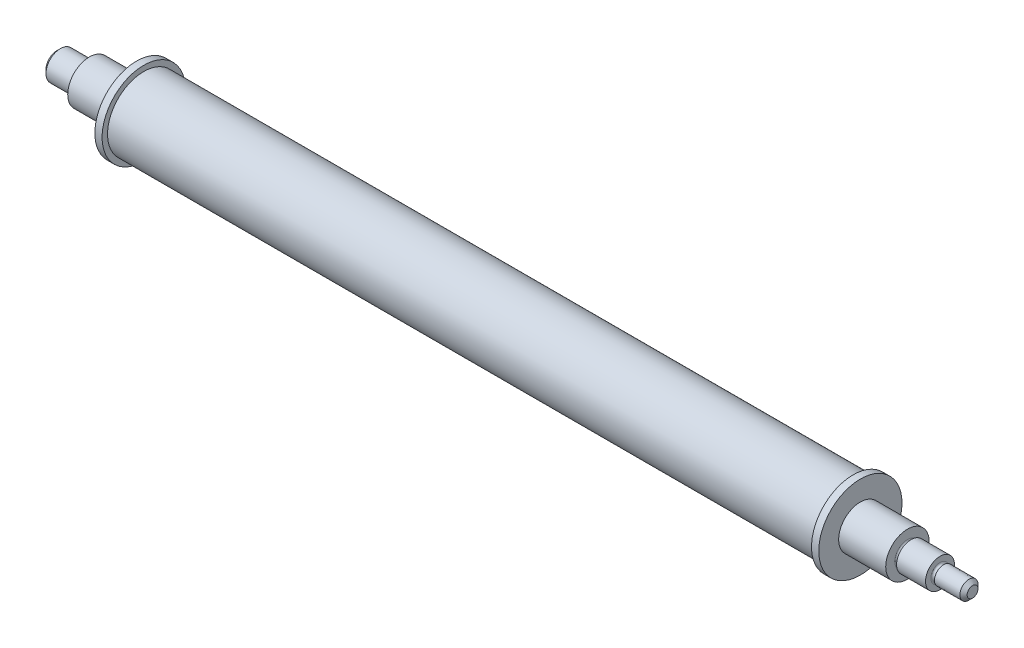
ISO-10303-21;
HEADER;
FILE_DESCRIPTION(('STEP AP214'),'2;1');
FILE_NAME('part.step','',(''),(''),'','','');
FILE_SCHEMA(('AUTOMOTIVE_DESIGN { 1 0 10303 214 1 1 1 1 }'));
ENDSEC;
DATA;
#1=APPLICATION_CONTEXT('core data for automotive mechanical design processes');
#2=APPLICATION_PROTOCOL_DEFINITION('international standard','automotive_design',2000,#1);
#3=PRODUCT_CONTEXT('',#1,'mechanical');
#4=PRODUCT('Part','Part','',(#3));
#5=PRODUCT_RELATED_PRODUCT_CATEGORY('part','',(#4));
#6=PRODUCT_DEFINITION_FORMATION('','',#4);
#7=PRODUCT_DEFINITION_CONTEXT('part definition',#1,'design');
#8=PRODUCT_DEFINITION('design','',#6,#7);
#9=PRODUCT_DEFINITION_SHAPE('','',#8);
#10=(LENGTH_UNIT() NAMED_UNIT(*) SI_UNIT(.MILLI.,.METRE.));
#11=(NAMED_UNIT(*) PLANE_ANGLE_UNIT() SI_UNIT($,.RADIAN.));
#12=(NAMED_UNIT(*) SI_UNIT($,.STERADIAN.) SOLID_ANGLE_UNIT());
#13=UNCERTAINTY_MEASURE_WITH_UNIT(LENGTH_MEASURE(1.E-05),#10,'distance_accuracy_value','');
#14=(GEOMETRIC_REPRESENTATION_CONTEXT(3) GLOBAL_UNCERTAINTY_ASSIGNED_CONTEXT((#13)) GLOBAL_UNIT_ASSIGNED_CONTEXT((#10,
#11,#12)) REPRESENTATION_CONTEXT('',''));
#15=CARTESIAN_POINT('',(0.,0.,0.));
#16=DIRECTION('',(0.,0.,1.));
#17=DIRECTION('',(1.,0.,0.));
#18=AXIS2_PLACEMENT_3D('',#15,#16,#17);
#19=CARTESIAN_POINT('',(98.,0.,0.));
#20=DIRECTION('',(-1.,0.,0.));
#21=DIRECTION('',(0.,0.,1.));
#22=AXIS2_PLACEMENT_3D('',#19,#20,#21);
#23=CYLINDRICAL_SURFACE('',#22,9.99999999999999);
#24=CARTESIAN_POINT('',(98.,0.,0.));
#25=DIRECTION('',(1.,0.,0.));
#26=DIRECTION('',(0.,0.,-1.));
#27=AXIS2_PLACEMENT_3D('',#24,#25,#26);
#28=CIRCLE('',#27,9.99999999999999);
#29=CARTESIAN_POINT('',(98.,0.,-9.99999999999999));
#30=VERTEX_POINT('',#29);
#31=EDGE_CURVE('E60',#30,#30,#28,.T.);
#32=ORIENTED_EDGE('',*,*,#31,.F.);
#33=EDGE_LOOP('',(#32));
#34=FACE_BOUND('',#33,.T.);
#35=CARTESIAN_POINT('',(-98.,0.,0.));
#36=DIRECTION('',(1.,0.,0.));
#37=DIRECTION('',(0.,0.,-1.));
#38=AXIS2_PLACEMENT_3D('',#35,#36,#37);
#39=CIRCLE('',#38,9.99999999999999);
#40=CARTESIAN_POINT('',(-98.,0.,-9.99999999999999));
#41=VERTEX_POINT('',#40);
#42=EDGE_CURVE('E67',#41,#41,#39,.T.);
#43=ORIENTED_EDGE('',*,*,#42,.T.);
#44=EDGE_LOOP('',(#43));
#45=FACE_BOUND('',#44,.T.);
#46=ADVANCED_FACE('F36',(#34,#45),#23,.T.);
#47=CARTESIAN_POINT('',(100.,0.,0.));
#48=DIRECTION('',(-1.,0.,0.));
#49=DIRECTION('',(0.,0.,1.));
#50=AXIS2_PLACEMENT_3D('',#47,#48,#49);
#51=CYLINDRICAL_SURFACE('',#50,11.5);
#52=CARTESIAN_POINT('',(100.,0.,0.));
#53=DIRECTION('',(1.,0.,0.));
#54=DIRECTION('',(0.,0.,-1.));
#55=AXIS2_PLACEMENT_3D('',#52,#53,#54);
#56=CIRCLE('',#55,11.5);
#57=CARTESIAN_POINT('',(100.,0.,-11.5));
#58=VERTEX_POINT('',#57);
#59=EDGE_CURVE('E63',#58,#58,#56,.T.);
#60=ORIENTED_EDGE('',*,*,#59,.F.);
#61=EDGE_LOOP('',(#60));
#62=FACE_BOUND('',#61,.T.);
#63=CARTESIAN_POINT('',(98.,0.,0.));
#64=DIRECTION('',(1.,0.,0.));
#65=DIRECTION('',(0.,0.,-1.));
#66=AXIS2_PLACEMENT_3D('',#63,#64,#65);
#67=CIRCLE('',#66,11.5);
#68=CARTESIAN_POINT('',(98.,0.,-11.5));
#69=VERTEX_POINT('',#68);
#70=EDGE_CURVE('E64',#69,#69,#67,.T.);
#71=ORIENTED_EDGE('',*,*,#70,.T.);
#72=EDGE_LOOP('',(#71));
#73=FACE_BOUND('',#72,.T.);
#74=ADVANCED_FACE('F149',(#62,#73),#51,.T.);
#75=CARTESIAN_POINT('',(100.,0.,0.));
#76=DIRECTION('',(1.,0.,0.));
#77=DIRECTION('',(0.,0.,-1.));
#78=AXIS2_PLACEMENT_3D('',#75,#76,#77);
#79=PLANE('',#78);
#80=CARTESIAN_POINT('',(100.,0.,0.));
#81=DIRECTION('',(-1.,0.,0.));
#82=DIRECTION('',(0.,0.,1.));
#83=AXIS2_PLACEMENT_3D('',#80,#81,#82);
#84=CIRCLE('',#83,6.);
#85=CARTESIAN_POINT('',(100.,0.,6.));
#86=VERTEX_POINT('',#85);
#87=EDGE_CURVE('E96',#86,#86,#84,.T.);
#88=ORIENTED_EDGE('',*,*,#87,.T.);
#89=EDGE_LOOP('',(#88));
#90=FACE_BOUND('',#89,.T.);
#91=ORIENTED_EDGE('',*,*,#59,.T.);
#92=EDGE_LOOP('',(#91));
#93=FACE_BOUND('',#92,.T.);
#94=ADVANCED_FACE('F155',(#90,#93),#79,.T.);
#95=CARTESIAN_POINT('',(98.,0.,0.));
#96=DIRECTION('',(1.,0.,0.));
#97=DIRECTION('',(0.,0.,-1.));
#98=AXIS2_PLACEMENT_3D('',#95,#96,#97);
#99=PLANE('',#98);
#100=ORIENTED_EDGE('',*,*,#31,.T.);
#101=EDGE_LOOP('',(#100));
#102=FACE_BOUND('',#101,.T.);
#103=ORIENTED_EDGE('',*,*,#70,.F.);
#104=EDGE_LOOP('',(#103));
#105=FACE_BOUND('',#104,.T.);
#106=ADVANCED_FACE('F133',(#102,#105),#99,.F.);
#107=CARTESIAN_POINT('',(-100.,0.,0.));
#108=DIRECTION('',(1.,0.,0.));
#109=DIRECTION('',(0.,0.,1.));
#110=AXIS2_PLACEMENT_3D('',#107,#108,#109);
#111=CYLINDRICAL_SURFACE('',#110,11.5);
#112=CARTESIAN_POINT('',(-100.,0.,0.));
#113=DIRECTION('',(1.,0.,0.));
#114=DIRECTION('',(0.,0.,-1.));
#115=AXIS2_PLACEMENT_3D('',#112,#113,#114);
#116=CIRCLE('',#115,11.5);
#117=CARTESIAN_POINT('',(-100.,0.,-11.5));
#118=VERTEX_POINT('',#117);
#119=EDGE_CURVE('E72',#118,#118,#116,.T.);
#120=ORIENTED_EDGE('',*,*,#119,.T.);
#121=EDGE_LOOP('',(#120));
#122=FACE_BOUND('',#121,.T.);
#123=CARTESIAN_POINT('',(-98.,0.,0.));
#124=DIRECTION('',(1.,0.,0.));
#125=DIRECTION('',(0.,0.,-1.));
#126=AXIS2_PLACEMENT_3D('',#123,#124,#125);
#127=CIRCLE('',#126,11.5);
#128=CARTESIAN_POINT('',(-98.,0.,-11.5));
#129=VERTEX_POINT('',#128);
#130=EDGE_CURVE('E73',#129,#129,#127,.T.);
#131=ORIENTED_EDGE('',*,*,#130,.F.);
#132=EDGE_LOOP('',(#131));
#133=FACE_BOUND('',#132,.T.);
#134=ADVANCED_FACE('F127',(#122,#133),#111,.T.);
#135=CARTESIAN_POINT('',(-100.,0.,0.));
#136=DIRECTION('',(-1.,0.,0.));
#137=DIRECTION('',(0.,0.,-1.));
#138=AXIS2_PLACEMENT_3D('',#135,#136,#137);
#139=PLANE('',#138);
#140=CARTESIAN_POINT('',(-100.,0.,0.));
#141=DIRECTION('',(-1.,0.,0.));
#142=DIRECTION('',(0.,0.,1.));
#143=AXIS2_PLACEMENT_3D('',#140,#141,#142);
#144=CIRCLE('',#143,6.);
#145=CARTESIAN_POINT('',(-100.,0.,6.));
#146=VERTEX_POINT('',#145);
#147=EDGE_CURVE('E48',#146,#146,#144,.T.);
#148=ORIENTED_EDGE('',*,*,#147,.F.);
#149=EDGE_LOOP('',(#148));
#150=FACE_BOUND('',#149,.T.);
#151=ORIENTED_EDGE('',*,*,#119,.F.);
#152=EDGE_LOOP('',(#151));
#153=FACE_BOUND('',#152,.T.);
#154=ADVANCED_FACE('F123',(#150,#153),#139,.T.);
#155=CARTESIAN_POINT('',(-98.,0.,0.));
#156=DIRECTION('',(-1.,0.,0.));
#157=DIRECTION('',(0.,0.,-1.));
#158=AXIS2_PLACEMENT_3D('',#155,#156,#157);
#159=PLANE('',#158);
#160=ORIENTED_EDGE('',*,*,#42,.F.);
#161=EDGE_LOOP('',(#160));
#162=FACE_BOUND('',#161,.T.);
#163=ORIENTED_EDGE('',*,*,#130,.T.);
#164=EDGE_LOOP('',(#163));
#165=FACE_BOUND('',#164,.T.);
#166=ADVANCED_FACE('F126',(#162,#165),#159,.F.);
#167=CARTESIAN_POINT('',(122.5,0.,0.));
#168=DIRECTION('',(-1.,0.,0.));
#169=DIRECTION('',(0.,0.,1.));
#170=AXIS2_PLACEMENT_3D('',#167,#168,#169);
#171=TOROIDAL_SURFACE('',#170,2.52348411475518,0.5);
#172=CARTESIAN_POINT('',(123.,0.,0.));
#173=DIRECTION('',(-1.,0.,0.));
#174=DIRECTION('',(0.,0.,1.));
#175=AXIS2_PLACEMENT_3D('',#172,#173,#174);
#176=CIRCLE('',#175,2.52348411475518);
#177=CARTESIAN_POINT('',(123.,0.,2.52348411475518));
#178=VERTEX_POINT('',#177);
#179=EDGE_CURVE('E99',#178,#178,#176,.T.);
#180=ORIENTED_EDGE('',*,*,#179,.T.);
#181=EDGE_LOOP('',(#180));
#182=FACE_BOUND('',#181,.T.);
#183=CARTESIAN_POINT('',(122.,0.,0.));
#184=DIRECTION('',(-1.,0.,0.));
#185=DIRECTION('',(0.,0.,1.));
#186=AXIS2_PLACEMENT_3D('',#183,#184,#185);
#187=CIRCLE('',#186,2.52348411475518);
#188=CARTESIAN_POINT('',(122.,0.,2.52348411475518));
#189=VERTEX_POINT('',#188);
#190=EDGE_CURVE('E76',#189,#189,#187,.T.);
#191=ORIENTED_EDGE('',*,*,#190,.F.);
#192=EDGE_LOOP('',(#191));
#193=FACE_BOUND('',#192,.T.);
#194=ADVANCED_FACE('F138',(#182,#193),#171,.F.);
#195=CARTESIAN_POINT('',(122.,0.,0.));
#196=DIRECTION('',(-1.,0.,0.));
#197=DIRECTION('',(0.,0.,1.));
#198=AXIS2_PLACEMENT_3D('',#195,#196,#197);
#199=PLANE('',#198);
#200=CARTESIAN_POINT('',(122.,0.,0.));
#201=DIRECTION('',(-1.,0.,0.));
#202=DIRECTION('',(0.,0.,1.));
#203=AXIS2_PLACEMENT_3D('',#200,#201,#202);
#204=CIRCLE('',#203,4.);
#205=CARTESIAN_POINT('',(122.,0.,4.));
#206=VERTEX_POINT('',#205);
#207=EDGE_CURVE('E81',#206,#206,#204,.T.);
#208=ORIENTED_EDGE('',*,*,#207,.F.);
#209=EDGE_LOOP('',(#208));
#210=FACE_BOUND('',#209,.T.);
#211=ORIENTED_EDGE('',*,*,#190,.T.);
#212=EDGE_LOOP('',(#211));
#213=FACE_BOUND('',#212,.T.);
#214=ADVANCED_FACE('F144',(#210,#213),#199,.F.);
#215=CARTESIAN_POINT('',(0.,0.,0.));
#216=DIRECTION('',(-1.,0.,0.));
#217=DIRECTION('',(0.,0.,1.));
#218=AXIS2_PLACEMENT_3D('',#215,#216,#217);
#219=CYLINDRICAL_SURFACE('',#218,4.);
#220=ORIENTED_EDGE('',*,*,#207,.T.);
#221=EDGE_LOOP('',(#220));
#222=FACE_BOUND('',#221,.T.);
#223=CARTESIAN_POINT('',(114.,0.,0.));
#224=DIRECTION('',(-1.,0.,0.));
#225=DIRECTION('',(0.,0.,1.));
#226=AXIS2_PLACEMENT_3D('',#223,#224,#225);
#227=CIRCLE('',#226,4.);
#228=CARTESIAN_POINT('',(114.,0.,4.));
#229=VERTEX_POINT('',#228);
#230=EDGE_CURVE('E84',#229,#229,#227,.T.);
#231=ORIENTED_EDGE('',*,*,#230,.F.);
#232=EDGE_LOOP('',(#231));
#233=FACE_BOUND('',#232,.T.);
#234=ADVANCED_FACE('F187',(#222,#233),#219,.T.);
#235=CARTESIAN_POINT('',(114.,0.,0.));
#236=DIRECTION('',(1.,0.,0.));
#237=DIRECTION('',(0.,0.,-1.));
#238=AXIS2_PLACEMENT_3D('',#235,#236,#237);
#239=PLANE('',#238);
#240=CARTESIAN_POINT('',(114.,0.,0.));
#241=DIRECTION('',(-1.,0.,0.));
#242=DIRECTION('',(0.,0.,1.));
#243=AXIS2_PLACEMENT_3D('',#240,#241,#242);
#244=CIRCLE('',#243,3.5);
#245=CARTESIAN_POINT('',(114.,0.,3.5));
#246=VERTEX_POINT('',#245);
#247=EDGE_CURVE('E87',#246,#246,#244,.T.);
#248=ORIENTED_EDGE('',*,*,#247,.F.);
#249=EDGE_LOOP('',(#248));
#250=FACE_BOUND('',#249,.T.);
#251=ORIENTED_EDGE('',*,*,#230,.T.);
#252=EDGE_LOOP('',(#251));
#253=FACE_BOUND('',#252,.T.);
#254=ADVANCED_FACE('F193',(#250,#253),#239,.F.);
#255=CARTESIAN_POINT('',(113.5,0.,0.));
#256=DIRECTION('',(-1.,0.,0.));
#257=DIRECTION('',(0.,0.,1.));
#258=AXIS2_PLACEMENT_3D('',#255,#256,#257);
#259=TOROIDAL_SURFACE('',#258,3.5,0.5);
#260=ORIENTED_EDGE('',*,*,#247,.T.);
#261=EDGE_LOOP('',(#260));
#262=FACE_BOUND('',#261,.T.);
#263=CARTESIAN_POINT('',(113.,0.,0.));
#264=DIRECTION('',(-1.,0.,0.));
#265=DIRECTION('',(0.,0.,1.));
#266=AXIS2_PLACEMENT_3D('',#263,#264,#265);
#267=CIRCLE('',#266,3.5);
#268=CARTESIAN_POINT('',(113.,0.,3.5));
#269=VERTEX_POINT('',#268);
#270=EDGE_CURVE('E90',#269,#269,#267,.T.);
#271=ORIENTED_EDGE('',*,*,#270,.F.);
#272=EDGE_LOOP('',(#271));
#273=FACE_BOUND('',#272,.T.);
#274=ADVANCED_FACE('F200',(#262,#273),#259,.F.);
#275=CARTESIAN_POINT('',(113.,0.,0.));
#276=DIRECTION('',(1.,0.,0.));
#277=DIRECTION('',(0.,0.,-1.));
#278=AXIS2_PLACEMENT_3D('',#275,#276,#277);
#279=PLANE('',#278);
#280=ORIENTED_EDGE('',*,*,#270,.T.);
#281=EDGE_LOOP('',(#280));
#282=FACE_BOUND('',#281,.T.);
#283=CARTESIAN_POINT('',(113.,0.,0.));
#284=DIRECTION('',(-1.,0.,0.));
#285=DIRECTION('',(0.,0.,1.));
#286=AXIS2_PLACEMENT_3D('',#283,#284,#285);
#287=CIRCLE('',#286,6.);
#288=CARTESIAN_POINT('',(113.,0.,6.));
#289=VERTEX_POINT('',#288);
#290=EDGE_CURVE('E93',#289,#289,#287,.T.);
#291=ORIENTED_EDGE('',*,*,#290,.F.);
#292=EDGE_LOOP('',(#291));
#293=FACE_BOUND('',#292,.T.);
#294=ADVANCED_FACE('F204',(#282,#293),#279,.T.);
#295=CARTESIAN_POINT('',(0.,0.,0.));
#296=DIRECTION('',(-1.,0.,0.));
#297=DIRECTION('',(0.,0.,1.));
#298=AXIS2_PLACEMENT_3D('',#295,#296,#297);
#299=CYLINDRICAL_SURFACE('',#298,6.);
#300=ORIENTED_EDGE('',*,*,#290,.T.);
#301=EDGE_LOOP('',(#300));
#302=FACE_BOUND('',#301,.T.);
#303=ORIENTED_EDGE('',*,*,#87,.F.);
#304=EDGE_LOOP('',(#303));
#305=FACE_BOUND('',#304,.T.);
#306=ADVANCED_FACE('F208',(#302,#305),#299,.T.);
#307=CARTESIAN_POINT('',(131.,0.,0.));
#308=DIRECTION('',(-1.,0.,0.));
#309=DIRECTION('',(0.,0.,1.));
#310=AXIS2_PLACEMENT_3D('',#307,#308,#309);
#311=PLANE('',#310);
#312=CARTESIAN_POINT('',(131.,0.,0.));
#313=DIRECTION('',(-1.,0.,0.));
#314=DIRECTION('',(0.,0.,1.));
#315=AXIS2_PLACEMENT_3D('',#312,#313,#314);
#316=CIRCLE('',#315,1.49999999999991);
#317=CARTESIAN_POINT('',(131.,0.,1.49999999999991));
#318=VERTEX_POINT('',#317);
#319=EDGE_CURVE('E52',#318,#318,#316,.F.);
#320=ORIENTED_EDGE('',*,*,#319,.T.);
#321=EDGE_LOOP('',(#320));
#322=FACE_BOUND('',#321,.T.);
#323=ADVANCED_FACE('F175',(#322),#311,.F.);
#324=CARTESIAN_POINT('',(131.,0.,0.));
#325=DIRECTION('',(-1.,0.,0.));
#326=DIRECTION('',(0.,0.,1.));
#327=AXIS2_PLACEMENT_3D('',#324,#325,#326);
#328=CONICAL_SURFACE('',#327,2.5,0.00293550591242591);
#329=CARTESIAN_POINT('',(129.997055843041,0.,0.));
#330=DIRECTION('',(1.,0.,0.));
#331=DIRECTION('',(0.,0.,-1.));
#332=AXIS2_PLACEMENT_3D('',#329,#330,#331);
#333=CIRCLE('',#332,2.50294415695938);
#334=CARTESIAN_POINT('',(129.997055843041,0.,-2.50294415695938));
#335=VERTEX_POINT('',#334);
#336=EDGE_CURVE('E57',#335,#335,#333,.F.);
#337=ORIENTED_EDGE('',*,*,#336,.T.);
#338=EDGE_LOOP('',(#337));
#339=FACE_BOUND('',#338,.T.);
#340=ORIENTED_EDGE('',*,*,#179,.F.);
#341=EDGE_LOOP('',(#340));
#342=FACE_BOUND('',#341,.T.);
#343=ADVANCED_FACE('F167',(#339,#342),#328,.T.);
#344=CARTESIAN_POINT('',(129.997055843041,0.,0.));
#345=DIRECTION('',(-1.,0.,0.));
#346=DIRECTION('',(0.,0.,1.));
#347=AXIS2_PLACEMENT_3D('',#344,#345,#346);
#348=CONICAL_SURFACE('',#347,2.50294415695938,0.785398163397447);
#349=ORIENTED_EDGE('',*,*,#319,.F.);
#350=EDGE_LOOP('',(#349));
#351=FACE_BOUND('',#350,.T.);
#352=ORIENTED_EDGE('',*,*,#336,.F.);
#353=EDGE_LOOP('',(#352));
#354=FACE_BOUND('',#353,.T.);
#355=ADVANCED_FACE('F162',(#351,#354),#348,.T.);
#356=CARTESIAN_POINT('',(-122.,0.,0.));
#357=DIRECTION('',(1.,0.,0.));
#358=DIRECTION('',(0.,0.,1.));
#359=AXIS2_PLACEMENT_3D('',#356,#357,#358);
#360=PLANE('',#359);
#361=CARTESIAN_POINT('',(-122.,0.,0.));
#362=DIRECTION('',(1.,0.,0.));
#363=DIRECTION('',(0.,0.,-1.));
#364=AXIS2_PLACEMENT_3D('',#361,#362,#363);
#365=CIRCLE('',#364,3.00000000000003);
#366=CARTESIAN_POINT('',(-122.,0.,-3.00000000000003));
#367=VERTEX_POINT('',#366);
#368=EDGE_CURVE('E44',#367,#367,#365,.F.);
#369=ORIENTED_EDGE('',*,*,#368,.T.);
#370=EDGE_LOOP('',(#369));
#371=FACE_BOUND('',#370,.T.);
#372=ADVANCED_FACE('F166',(#371),#360,.F.);
#373=CARTESIAN_POINT('',(0.,0.,0.));
#374=DIRECTION('',(1.,0.,0.));
#375=DIRECTION('',(0.,0.,1.));
#376=AXIS2_PLACEMENT_3D('',#373,#374,#375);
#377=CYLINDRICAL_SURFACE('',#376,4.);
#378=CARTESIAN_POINT('',(-121.,0.,0.));
#379=DIRECTION('',(1.,0.,0.));
#380=DIRECTION('',(0.,0.,-1.));
#381=AXIS2_PLACEMENT_3D('',#378,#379,#380);
#382=CIRCLE('',#381,4.);
#383=CARTESIAN_POINT('',(-121.,0.,-4.));
#384=VERTEX_POINT('',#383);
#385=EDGE_CURVE('E10',#384,#384,#382,.T.);
#386=ORIENTED_EDGE('',*,*,#385,.T.);
#387=EDGE_LOOP('',(#386));
#388=FACE_BOUND('',#387,.T.);
#389=CARTESIAN_POINT('',(-114.,0.,0.));
#390=DIRECTION('',(-1.,0.,0.));
#391=DIRECTION('',(0.,0.,1.));
#392=AXIS2_PLACEMENT_3D('',#389,#390,#391);
#393=CIRCLE('',#392,4.);
#394=CARTESIAN_POINT('',(-114.,0.,4.));
#395=VERTEX_POINT('',#394);
#396=EDGE_CURVE('E102',#395,#395,#393,.T.);
#397=ORIENTED_EDGE('',*,*,#396,.T.);
#398=EDGE_LOOP('',(#397));
#399=FACE_BOUND('',#398,.T.);
#400=ADVANCED_FACE('F173',(#388,#399),#377,.T.);
#401=CARTESIAN_POINT('',(-114.,0.,0.));
#402=DIRECTION('',(-1.,0.,0.));
#403=DIRECTION('',(0.,0.,-1.));
#404=AXIS2_PLACEMENT_3D('',#401,#402,#403);
#405=PLANE('',#404);
#406=CARTESIAN_POINT('',(-114.,0.,0.));
#407=DIRECTION('',(-1.,0.,0.));
#408=DIRECTION('',(0.,0.,1.));
#409=AXIS2_PLACEMENT_3D('',#406,#407,#408);
#410=CIRCLE('',#409,3.5);
#411=CARTESIAN_POINT('',(-114.,0.,3.5));
#412=VERTEX_POINT('',#411);
#413=EDGE_CURVE('E105',#412,#412,#410,.T.);
#414=ORIENTED_EDGE('',*,*,#413,.T.);
#415=EDGE_LOOP('',(#414));
#416=FACE_BOUND('',#415,.T.);
#417=ORIENTED_EDGE('',*,*,#396,.F.);
#418=EDGE_LOOP('',(#417));
#419=FACE_BOUND('',#418,.T.);
#420=ADVANCED_FACE('F218',(#416,#419),#405,.F.);
#421=CARTESIAN_POINT('',(-113.5,0.,0.));
#422=DIRECTION('',(1.,0.,0.));
#423=DIRECTION('',(0.,0.,1.));
#424=AXIS2_PLACEMENT_3D('',#421,#422,#423);
#425=TOROIDAL_SURFACE('',#424,3.5,0.5);
#426=ORIENTED_EDGE('',*,*,#413,.F.);
#427=EDGE_LOOP('',(#426));
#428=FACE_BOUND('',#427,.T.);
#429=CARTESIAN_POINT('',(-113.,0.,0.));
#430=DIRECTION('',(-1.,0.,0.));
#431=DIRECTION('',(0.,0.,1.));
#432=AXIS2_PLACEMENT_3D('',#429,#430,#431);
#433=CIRCLE('',#432,3.5);
#434=CARTESIAN_POINT('',(-113.,0.,3.5));
#435=VERTEX_POINT('',#434);
#436=EDGE_CURVE('E108',#435,#435,#433,.T.);
#437=ORIENTED_EDGE('',*,*,#436,.T.);
#438=EDGE_LOOP('',(#437));
#439=FACE_BOUND('',#438,.T.);
#440=ADVANCED_FACE('F221',(#428,#439),#425,.F.);
#441=CARTESIAN_POINT('',(-113.,0.,0.));
#442=DIRECTION('',(-1.,0.,0.));
#443=DIRECTION('',(0.,0.,-1.));
#444=AXIS2_PLACEMENT_3D('',#441,#442,#443);
#445=PLANE('',#444);
#446=ORIENTED_EDGE('',*,*,#436,.F.);
#447=EDGE_LOOP('',(#446));
#448=FACE_BOUND('',#447,.T.);
#449=CARTESIAN_POINT('',(-113.,0.,0.));
#450=DIRECTION('',(-1.,0.,0.));
#451=DIRECTION('',(0.,0.,1.));
#452=AXIS2_PLACEMENT_3D('',#449,#450,#451);
#453=CIRCLE('',#452,6.);
#454=CARTESIAN_POINT('',(-113.,0.,6.));
#455=VERTEX_POINT('',#454);
#456=EDGE_CURVE('E111',#455,#455,#453,.T.);
#457=ORIENTED_EDGE('',*,*,#456,.T.);
#458=EDGE_LOOP('',(#457));
#459=FACE_BOUND('',#458,.T.);
#460=ADVANCED_FACE('F115',(#448,#459),#445,.T.);
#461=CARTESIAN_POINT('',(0.,0.,0.));
#462=DIRECTION('',(1.,0.,0.));
#463=DIRECTION('',(0.,0.,1.));
#464=AXIS2_PLACEMENT_3D('',#461,#462,#463);
#465=CYLINDRICAL_SURFACE('',#464,6.);
#466=ORIENTED_EDGE('',*,*,#456,.F.);
#467=EDGE_LOOP('',(#466));
#468=FACE_BOUND('',#467,.T.);
#469=ORIENTED_EDGE('',*,*,#147,.T.);
#470=EDGE_LOOP('',(#469));
#471=FACE_BOUND('',#470,.T.);
#472=ADVANCED_FACE('F117',(#468,#471),#465,.T.);
#473=CARTESIAN_POINT('',(-122.,0.,0.));
#474=DIRECTION('',(1.,0.,0.));
#475=DIRECTION('',(0.,0.,-1.));
#476=AXIS2_PLACEMENT_3D('',#473,#474,#475);
#477=CONICAL_SURFACE('',#476,3.00000000000003,0.785398163397454);
#478=ORIENTED_EDGE('',*,*,#385,.F.);
#479=EDGE_LOOP('',(#478));
#480=FACE_BOUND('',#479,.T.);
#481=ORIENTED_EDGE('',*,*,#368,.F.);
#482=EDGE_LOOP('',(#481));
#483=FACE_BOUND('',#482,.T.);
#484=ADVANCED_FACE('F39',(#480,#483),#477,.T.);
#485=CLOSED_SHELL('',(#46,#74,#94,#106,#134,#154,#166,#194,#214,#234,#254,#274,#294,#306,#323,
#343,#355,#372,#400,#420,#440,#460,#472,#484));
#486=MANIFOLD_SOLID_BREP('B2',#485);
#487=ADVANCED_BREP_SHAPE_REPRESENTATION('',(#18,#486),#14);
#488=SHAPE_DEFINITION_REPRESENTATION(#9,#487);
ENDSEC;
END-ISO-10303-21;
